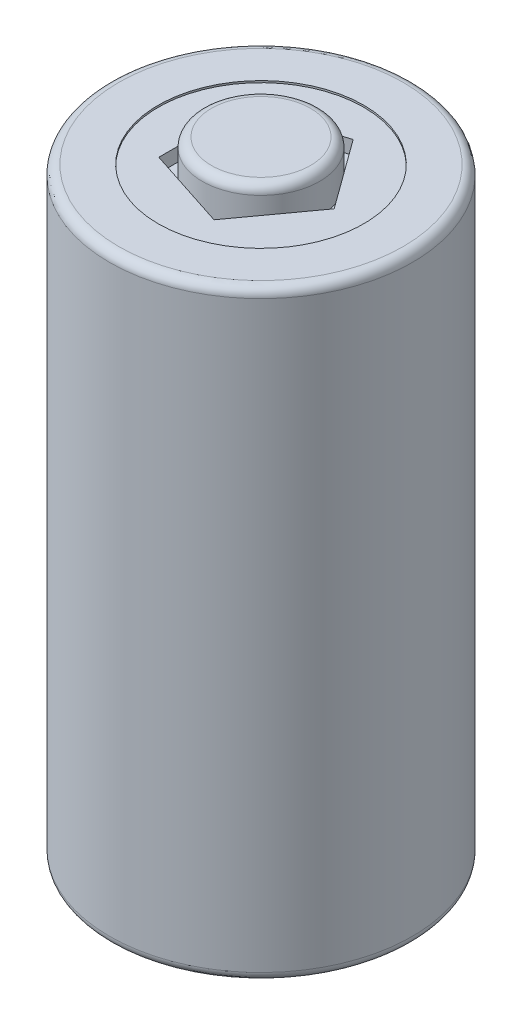
ISO-10303-21;
HEADER;
FILE_DESCRIPTION(('STEP AP214'),'2;1');
FILE_NAME('part.step','',(''),(''),'','','');
FILE_SCHEMA(('AUTOMOTIVE_DESIGN { 1 0 10303 214 1 1 1 1 }'));
ENDSEC;
DATA;
#1=APPLICATION_CONTEXT('core data for automotive mechanical design processes');
#2=APPLICATION_PROTOCOL_DEFINITION('international standard','automotive_design',2000,#1);
#3=PRODUCT_CONTEXT('',#1,'mechanical');
#4=PRODUCT('Part','Part','',(#3));
#5=PRODUCT_RELATED_PRODUCT_CATEGORY('part','',(#4));
#6=PRODUCT_DEFINITION_FORMATION('','',#4);
#7=PRODUCT_DEFINITION_CONTEXT('part definition',#1,'design');
#8=PRODUCT_DEFINITION('design','',#6,#7);
#9=PRODUCT_DEFINITION_SHAPE('','',#8);
#10=(LENGTH_UNIT() NAMED_UNIT(*) SI_UNIT(.MILLI.,.METRE.));
#11=(NAMED_UNIT(*) PLANE_ANGLE_UNIT() SI_UNIT($,.RADIAN.));
#12=(NAMED_UNIT(*) SI_UNIT($,.STERADIAN.) SOLID_ANGLE_UNIT());
#13=UNCERTAINTY_MEASURE_WITH_UNIT(LENGTH_MEASURE(1.E-05),#10,'distance_accuracy_value','');
#14=(GEOMETRIC_REPRESENTATION_CONTEXT(3) GLOBAL_UNCERTAINTY_ASSIGNED_CONTEXT((#13)) GLOBAL_UNIT_ASSIGNED_CONTEXT((#10,
#11,#12)) REPRESENTATION_CONTEXT('',''));
#15=CARTESIAN_POINT('',(0.,0.,0.));
#16=DIRECTION('',(0.,0.,1.));
#17=DIRECTION('',(1.,0.,0.));
#18=AXIS2_PLACEMENT_3D('',#15,#16,#17);
#19=CARTESIAN_POINT('',(0.,-16.4,0.));
#20=DIRECTION('',(0.,-1.,0.));
#21=DIRECTION('',(0.,0.,-1.));
#22=AXIS2_PLACEMENT_3D('',#19,#20,#21);
#23=CYLINDRICAL_SURFACE('',#22,8.24999999999999);
#24=CARTESIAN_POINT('',(0.,-15.9,0.));
#25=DIRECTION('',(0.,-1.,0.));
#26=DIRECTION('',(0.,0.,-1.));
#27=AXIS2_PLACEMENT_3D('',#24,#25,#26);
#28=CIRCLE('',#27,8.24999999999999);
#29=CARTESIAN_POINT('',(0.,-15.9,-8.24999999999999));
#30=VERTEX_POINT('',#29);
#31=EDGE_CURVE('E44',#30,#30,#28,.F.);
#32=ORIENTED_EDGE('',*,*,#31,.T.);
#33=EDGE_LOOP('',(#32));
#34=FACE_BOUND('',#33,.T.);
#35=CARTESIAN_POINT('',(0.,15.9,0.));
#36=DIRECTION('',(0.,1.,0.));
#37=DIRECTION('',(0.,0.,1.));
#38=AXIS2_PLACEMENT_3D('',#35,#36,#37);
#39=CIRCLE('',#38,8.24999999999999);
#40=CARTESIAN_POINT('',(0.,15.9,8.24999999999999));
#41=VERTEX_POINT('',#40);
#42=EDGE_CURVE('E151',#41,#41,#39,.F.);
#43=ORIENTED_EDGE('',*,*,#42,.T.);
#44=EDGE_LOOP('',(#43));
#45=FACE_BOUND('',#44,.T.);
#46=ADVANCED_FACE('F36',(#34,#45),#23,.T.);
#47=CARTESIAN_POINT('',(0.,16.4,0.));
#48=DIRECTION('',(0.,1.,0.));
#49=DIRECTION('',(0.,0.,1.));
#50=AXIS2_PLACEMENT_3D('',#47,#48,#49);
#51=PLANE('',#50);
#52=CARTESIAN_POINT('',(0.,16.4,0.));
#53=DIRECTION('',(0.,1.,0.));
#54=DIRECTION('',(0.,0.,1.));
#55=AXIS2_PLACEMENT_3D('',#52,#53,#54);
#56=CIRCLE('',#55,7.74999999999999);
#57=CARTESIAN_POINT('',(0.,16.4,7.74999999999999));
#58=VERTEX_POINT('',#57);
#59=EDGE_CURVE('E12',#58,#58,#56,.T.);
#60=ORIENTED_EDGE('',*,*,#59,.T.);
#61=EDGE_LOOP('',(#60));
#62=FACE_BOUND('',#61,.T.);
#63=CARTESIAN_POINT('',(0.,16.4,0.));
#64=DIRECTION('',(0.,1.,0.));
#65=DIRECTION('',(0.,0.,1.));
#66=AXIS2_PLACEMENT_3D('',#63,#64,#65);
#67=CIRCLE('',#66,5.6);
#68=CARTESIAN_POINT('',(0.,16.4,5.6));
#69=VERTEX_POINT('',#68);
#70=EDGE_CURVE('E127',#69,#69,#67,.T.);
#71=ORIENTED_EDGE('',*,*,#70,.F.);
#72=EDGE_LOOP('',(#71));
#73=FACE_BOUND('',#72,.T.);
#74=ADVANCED_FACE('F168',(#62,#73),#51,.T.);
#75=CARTESIAN_POINT('',(0.,-16.4,0.));
#76=DIRECTION('',(0.,-1.,0.));
#77=DIRECTION('',(0.,0.,-1.));
#78=AXIS2_PLACEMENT_3D('',#75,#76,#77);
#79=PLANE('',#78);
#80=CARTESIAN_POINT('',(0.,-16.4,0.));
#81=DIRECTION('',(0.,-1.,0.));
#82=DIRECTION('',(0.,0.,-1.));
#83=AXIS2_PLACEMENT_3D('',#80,#81,#82);
#84=CIRCLE('',#83,7.74999999999999);
#85=CARTESIAN_POINT('',(0.,-16.4,-7.74999999999999));
#86=VERTEX_POINT('',#85);
#87=EDGE_CURVE('E148',#86,#86,#84,.T.);
#88=ORIENTED_EDGE('',*,*,#87,.T.);
#89=EDGE_LOOP('',(#88));
#90=FACE_BOUND('',#89,.T.);
#91=CARTESIAN_POINT('',(0.,-16.4,0.));
#92=DIRECTION('',(0.,-1.,0.));
#93=DIRECTION('',(0.,0.,-1.));
#94=AXIS2_PLACEMENT_3D('',#91,#92,#93);
#95=CIRCLE('',#94,5.6);
#96=CARTESIAN_POINT('',(0.,-16.4,-5.6));
#97=VERTEX_POINT('',#96);
#98=EDGE_CURVE('E134',#97,#97,#95,.T.);
#99=ORIENTED_EDGE('',*,*,#98,.F.);
#100=EDGE_LOOP('',(#99));
#101=FACE_BOUND('',#100,.T.);
#102=ADVANCED_FACE('F164',(#90,#101),#79,.T.);
#103=CARTESIAN_POINT('',(0.,-15.65,0.));
#104=DIRECTION('',(0.,-1.,0.));
#105=DIRECTION('',(0.,0.,-1.));
#106=AXIS2_PLACEMENT_3D('',#103,#104,#105);
#107=CYLINDRICAL_SURFACE('',#106,5.6);
#108=CARTESIAN_POINT('',(0.,-16.3,0.));
#109=DIRECTION('',(0.,-1.,0.));
#110=DIRECTION('',(0.,0.,-1.));
#111=AXIS2_PLACEMENT_3D('',#108,#109,#110);
#112=CIRCLE('',#111,5.6);
#113=CARTESIAN_POINT('',(0.,-16.3,-5.6));
#114=VERTEX_POINT('',#113);
#115=EDGE_CURVE('E249',#114,#114,#112,.T.);
#116=ORIENTED_EDGE('',*,*,#115,.F.);
#117=EDGE_LOOP('',(#116));
#118=FACE_BOUND('',#117,.T.);
#119=ORIENTED_EDGE('',*,*,#98,.T.);
#120=EDGE_LOOP('',(#119));
#121=FACE_BOUND('',#120,.T.);
#122=ADVANCED_FACE('F167',(#118,#121),#107,.F.);
#123=CARTESIAN_POINT('',(0.,16.3,0.));
#124=DIRECTION('',(0.,1.,0.));
#125=DIRECTION('',(0.,0.,1.));
#126=AXIS2_PLACEMENT_3D('',#123,#124,#125);
#127=CYLINDRICAL_SURFACE('',#126,5.6);
#128=CARTESIAN_POINT('',(0.,16.3,0.));
#129=DIRECTION('',(0.,1.,0.));
#130=DIRECTION('',(0.,0.,1.));
#131=AXIS2_PLACEMENT_3D('',#128,#129,#130);
#132=CIRCLE('',#131,5.6);
#133=CARTESIAN_POINT('',(0.,16.3,5.6));
#134=VERTEX_POINT('',#133);
#135=EDGE_CURVE('E131',#134,#134,#132,.T.);
#136=ORIENTED_EDGE('',*,*,#135,.F.);
#137=EDGE_LOOP('',(#136));
#138=FACE_BOUND('',#137,.T.);
#139=ORIENTED_EDGE('',*,*,#70,.T.);
#140=EDGE_LOOP('',(#139));
#141=FACE_BOUND('',#140,.T.);
#142=ADVANCED_FACE('F173',(#138,#141),#127,.F.);
#143=CARTESIAN_POINT('',(0.,16.3,0.));
#144=DIRECTION('',(0.,1.,0.));
#145=DIRECTION('',(0.,0.,1.));
#146=AXIS2_PLACEMENT_3D('',#143,#144,#145);
#147=PLANE('',#146);
#148=DIRECTION('',(-0.951056516295154,0.,0.309016994374947));
#149=VECTOR('',#148,1.);
#150=CARTESIAN_POINT('',(1.23184038628159,16.3,-3.79121487728645));
#151=LINE('',#150,#149);
#152=CARTESIAN_POINT('',(1.23184038628159,16.3,-3.79121487728645));
#153=VERTEX_POINT('',#152);
#154=CARTESIAN_POINT('',(-3.225,16.3,-2.34309965281729));
#155=VERTEX_POINT('',#154);
#156=EDGE_CURVE('E51',#153,#155,#151,.T.);
#157=ORIENTED_EDGE('',*,*,#156,.F.);
#158=DIRECTION('',(-0.587785252292474,0.,-0.809016994374947));
#159=VECTOR('',#158,1.);
#160=CARTESIAN_POINT('',(3.98631922743683,16.3,0.));
#161=LINE('',#160,#159);
#162=CARTESIAN_POINT('',(3.98631922743683,16.3,0.));
#163=VERTEX_POINT('',#162);
#164=EDGE_CURVE('E124',#163,#153,#161,.T.);
#165=ORIENTED_EDGE('',*,*,#164,.F.);
#166=DIRECTION('',(0.587785252292478,0.,-0.809016994374944));
#167=VECTOR('',#166,1.);
#168=CARTESIAN_POINT('',(1.23184038628157,16.3,3.79121487728643));
#169=LINE('',#168,#167);
#170=CARTESIAN_POINT('',(1.23184038628157,16.3,3.79121487728643));
#171=VERTEX_POINT('',#170);
#172=EDGE_CURVE('E122',#171,#163,#169,.T.);
#173=ORIENTED_EDGE('',*,*,#172,.F.);
#174=DIRECTION('',(0.951056516295155,0.,0.309016994374943));
#175=VECTOR('',#174,1.);
#176=CARTESIAN_POINT('',(-3.22500000000002,16.3,2.34309965281729));
#177=LINE('',#176,#175);
#178=CARTESIAN_POINT('',(-3.22500000000002,16.3,2.34309965281729));
#179=VERTEX_POINT('',#178);
#180=EDGE_CURVE('E93',#179,#171,#177,.T.);
#181=ORIENTED_EDGE('',*,*,#180,.F.);
#182=DIRECTION('',(0.,0.,1.));
#183=VECTOR('',#182,1.);
#184=CARTESIAN_POINT('',(-3.225,16.3,-2.34309965281729));
#185=LINE('',#184,#183);
#186=EDGE_CURVE('E117',#155,#179,#185,.T.);
#187=ORIENTED_EDGE('',*,*,#186,.F.);
#188=EDGE_LOOP('',(#157,#165,#173,#181,#187));
#189=FACE_BOUND('',#188,.T.);
#190=ORIENTED_EDGE('',*,*,#135,.T.);
#191=EDGE_LOOP('',(#190));
#192=FACE_BOUND('',#191,.T.);
#193=ADVANCED_FACE('F179',(#189,#192),#147,.T.);
#194=CARTESIAN_POINT('',(1.23184038628159,15.55,-3.79121487728645));
#195=DIRECTION('',(-0.309016994374947,0.,-0.951056516295154));
#196=DIRECTION('',(-0.951056516295154,0.,0.309016994374947));
#197=AXIS2_PLACEMENT_3D('',#194,#195,#196);
#198=PLANE('',#197);
#199=ORIENTED_EDGE('',*,*,#156,.T.);
#200=DIRECTION('',(0.,1.,0.));
#201=VECTOR('',#200,1.);
#202=CARTESIAN_POINT('',(-3.225,15.55,-2.34309965281729));
#203=LINE('',#202,#201);
#204=CARTESIAN_POINT('',(-3.225,15.55,-2.34309965281729));
#205=VERTEX_POINT('',#204);
#206=EDGE_CURVE('E78',#205,#155,#203,.T.);
#207=ORIENTED_EDGE('',*,*,#206,.F.);
#208=DIRECTION('',(-0.951056516295154,0.,0.309016994374947));
#209=VECTOR('',#208,1.);
#210=CARTESIAN_POINT('',(1.23184038628159,15.55,-3.79121487728645));
#211=LINE('',#210,#209);
#212=CARTESIAN_POINT('',(1.23184038628159,15.55,-3.79121487728645));
#213=VERTEX_POINT('',#212);
#214=EDGE_CURVE('E111',#213,#205,#211,.T.);
#215=ORIENTED_EDGE('',*,*,#214,.F.);
#216=DIRECTION('',(0.,1.,0.));
#217=VECTOR('',#216,1.);
#218=CARTESIAN_POINT('',(1.23184038628159,15.55,-3.79121487728645));
#219=LINE('',#218,#217);
#220=EDGE_CURVE('E59',#213,#153,#219,.T.);
#221=ORIENTED_EDGE('',*,*,#220,.T.);
#222=EDGE_LOOP('',(#199,#207,#215,#221));
#223=FACE_BOUND('',#222,.T.);
#224=ADVANCED_FACE('F228',(#223),#198,.F.);
#225=CARTESIAN_POINT('',(3.98631922743683,15.55,0.));
#226=DIRECTION('',(0.809016994374947,0.,-0.587785252292474));
#227=DIRECTION('',(-0.587785252292474,0.,-0.809016994374947));
#228=AXIS2_PLACEMENT_3D('',#225,#226,#227);
#229=PLANE('',#228);
#230=ORIENTED_EDGE('',*,*,#164,.T.);
#231=ORIENTED_EDGE('',*,*,#220,.F.);
#232=DIRECTION('',(-0.587785252292474,0.,-0.809016994374947));
#233=VECTOR('',#232,1.);
#234=CARTESIAN_POINT('',(3.98631922743683,15.55,0.));
#235=LINE('',#234,#233);
#236=CARTESIAN_POINT('',(3.98631922743683,15.55,0.));
#237=VERTEX_POINT('',#236);
#238=EDGE_CURVE('E105',#237,#213,#235,.T.);
#239=ORIENTED_EDGE('',*,*,#238,.F.);
#240=DIRECTION('',(0.,1.,0.));
#241=VECTOR('',#240,1.);
#242=CARTESIAN_POINT('',(3.98631922743683,15.55,0.));
#243=LINE('',#242,#241);
#244=EDGE_CURVE('E97',#237,#163,#243,.T.);
#245=ORIENTED_EDGE('',*,*,#244,.T.);
#246=EDGE_LOOP('',(#230,#231,#239,#245));
#247=FACE_BOUND('',#246,.T.);
#248=ADVANCED_FACE('F225',(#247),#229,.F.);
#249=CARTESIAN_POINT('',(1.23184038628157,15.55,3.79121487728643));
#250=DIRECTION('',(0.809016994374944,0.,0.587785252292478));
#251=DIRECTION('',(0.587785252292478,0.,-0.809016994374944));
#252=AXIS2_PLACEMENT_3D('',#249,#250,#251);
#253=PLANE('',#252);
#254=ORIENTED_EDGE('',*,*,#172,.T.);
#255=ORIENTED_EDGE('',*,*,#244,.F.);
#256=DIRECTION('',(0.587785252292478,0.,-0.809016994374944));
#257=VECTOR('',#256,1.);
#258=CARTESIAN_POINT('',(1.23184038628157,15.55,3.79121487728643));
#259=LINE('',#258,#257);
#260=CARTESIAN_POINT('',(1.23184038628157,15.55,3.79121487728643));
#261=VERTEX_POINT('',#260);
#262=EDGE_CURVE('E101',#261,#237,#259,.T.);
#263=ORIENTED_EDGE('',*,*,#262,.F.);
#264=DIRECTION('',(0.,1.,0.));
#265=VECTOR('',#264,1.);
#266=CARTESIAN_POINT('',(1.23184038628157,15.55,3.79121487728643));
#267=LINE('',#266,#265);
#268=EDGE_CURVE('E86',#261,#171,#267,.T.);
#269=ORIENTED_EDGE('',*,*,#268,.T.);
#270=EDGE_LOOP('',(#254,#255,#263,#269));
#271=FACE_BOUND('',#270,.T.);
#272=ADVANCED_FACE('F102',(#271),#253,.F.);
#273=CARTESIAN_POINT('',(-3.22500000000002,15.55,2.34309965281729));
#274=DIRECTION('',(-0.309016994374943,0.,0.951056516295155));
#275=DIRECTION('',(0.951056516295155,0.,0.309016994374943));
#276=AXIS2_PLACEMENT_3D('',#273,#274,#275);
#277=PLANE('',#276);
#278=ORIENTED_EDGE('',*,*,#180,.T.);
#279=ORIENTED_EDGE('',*,*,#268,.F.);
#280=DIRECTION('',(0.951056516295155,0.,0.309016994374943));
#281=VECTOR('',#280,1.);
#282=CARTESIAN_POINT('',(-3.22500000000002,15.55,2.34309965281729));
#283=LINE('',#282,#281);
#284=CARTESIAN_POINT('',(-3.22500000000002,15.55,2.34309965281729));
#285=VERTEX_POINT('',#284);
#286=EDGE_CURVE('E90',#285,#261,#283,.T.);
#287=ORIENTED_EDGE('',*,*,#286,.F.);
#288=DIRECTION('',(0.,1.,0.));
#289=VECTOR('',#288,1.);
#290=CARTESIAN_POINT('',(-3.22500000000002,15.55,2.34309965281729));
#291=LINE('',#290,#289);
#292=EDGE_CURVE('E98',#285,#179,#291,.T.);
#293=ORIENTED_EDGE('',*,*,#292,.T.);
#294=EDGE_LOOP('',(#278,#279,#287,#293));
#295=FACE_BOUND('',#294,.T.);
#296=ADVANCED_FACE('F88',(#295),#277,.F.);
#297=CARTESIAN_POINT('',(-3.225,15.55,-2.34309965281729));
#298=DIRECTION('',(-1.,0.,0.));
#299=DIRECTION('',(0.,0.,1.));
#300=AXIS2_PLACEMENT_3D('',#297,#298,#299);
#301=PLANE('',#300);
#302=ORIENTED_EDGE('',*,*,#186,.T.);
#303=ORIENTED_EDGE('',*,*,#292,.F.);
#304=DIRECTION('',(0.,0.,1.));
#305=VECTOR('',#304,1.);
#306=CARTESIAN_POINT('',(-3.225,15.55,-2.34309965281729));
#307=LINE('',#306,#305);
#308=EDGE_CURVE('E109',#205,#285,#307,.T.);
#309=ORIENTED_EDGE('',*,*,#308,.F.);
#310=ORIENTED_EDGE('',*,*,#206,.T.);
#311=EDGE_LOOP('',(#302,#303,#309,#310));
#312=FACE_BOUND('',#311,.T.);
#313=ADVANCED_FACE('F217',(#312),#301,.F.);
#314=CARTESIAN_POINT('',(1.23184038628159,15.55,-3.79121487728645));
#315=DIRECTION('',(0.,-1.,0.));
#316=DIRECTION('',(0.,0.,-1.));
#317=AXIS2_PLACEMENT_3D('',#314,#315,#316);
#318=PLANE('',#317);
#319=CARTESIAN_POINT('',(0.,15.55,0.));
#320=DIRECTION('',(0.,-1.,0.));
#321=DIRECTION('',(0.,0.,-1.));
#322=AXIS2_PLACEMENT_3D('',#319,#320,#321);
#323=CIRCLE('',#322,3.2);
#324=CARTESIAN_POINT('',(0.,15.55,-3.2));
#325=VERTEX_POINT('',#324);
#326=EDGE_CURVE('E139',#325,#325,#323,.F.);
#327=ORIENTED_EDGE('',*,*,#326,.F.);
#328=EDGE_LOOP('',(#327));
#329=FACE_BOUND('',#328,.T.);
#330=ORIENTED_EDGE('',*,*,#214,.T.);
#331=ORIENTED_EDGE('',*,*,#308,.T.);
#332=ORIENTED_EDGE('',*,*,#286,.T.);
#333=ORIENTED_EDGE('',*,*,#262,.T.);
#334=ORIENTED_EDGE('',*,*,#238,.T.);
#335=EDGE_LOOP('',(#330,#331,#332,#333,#334));
#336=FACE_BOUND('',#335,.T.);
#337=ADVANCED_FACE('F108',(#329,#336),#318,.F.);
#338=CARTESIAN_POINT('',(0.,90.6509667991878,0.));
#339=DIRECTION('',(0.,-1.,0.));
#340=DIRECTION('',(0.,0.,-1.));
#341=AXIS2_PLACEMENT_3D('',#338,#339,#340);
#342=CYLINDRICAL_SURFACE('',#341,3.2);
#343=CARTESIAN_POINT('',(0.,17.2,0.));
#344=DIRECTION('',(0.,-1.,0.));
#345=DIRECTION('',(0.,0.,-1.));
#346=AXIS2_PLACEMENT_3D('',#343,#344,#345);
#347=CIRCLE('',#346,3.2);
#348=CARTESIAN_POINT('',(0.,17.2,-3.2));
#349=VERTEX_POINT('',#348);
#350=EDGE_CURVE('E142',#349,#349,#347,.T.);
#351=ORIENTED_EDGE('',*,*,#350,.T.);
#352=EDGE_LOOP('',(#351));
#353=FACE_BOUND('',#352,.T.);
#354=ORIENTED_EDGE('',*,*,#326,.T.);
#355=EDGE_LOOP('',(#354));
#356=FACE_BOUND('',#355,.T.);
#357=ADVANCED_FACE('F204',(#353,#356),#342,.T.);
#358=CARTESIAN_POINT('',(0.,17.7,0.));
#359=DIRECTION('',(0.,-1.,0.));
#360=DIRECTION('',(0.,0.,-1.));
#361=AXIS2_PLACEMENT_3D('',#358,#359,#360);
#362=PLANE('',#361);
#363=CARTESIAN_POINT('',(0.,17.7,0.));
#364=DIRECTION('',(0.,-1.,0.));
#365=DIRECTION('',(0.,0.,-1.));
#366=AXIS2_PLACEMENT_3D('',#363,#364,#365);
#367=CIRCLE('',#366,2.7);
#368=CARTESIAN_POINT('',(0.,17.7,-2.7));
#369=VERTEX_POINT('',#368);
#370=EDGE_CURVE('E145',#369,#369,#367,.F.);
#371=ORIENTED_EDGE('',*,*,#370,.T.);
#372=EDGE_LOOP('',(#371));
#373=FACE_BOUND('',#372,.T.);
#374=ADVANCED_FACE('F195',(#373),#362,.F.);
#375=CARTESIAN_POINT('',(0.,17.2,0.));
#376=DIRECTION('',(0.,-1.,0.));
#377=DIRECTION('',(0.,0.,-1.));
#378=AXIS2_PLACEMENT_3D('',#375,#376,#377);
#379=TOROIDAL_SURFACE('',#378,2.7,0.5);
#380=ORIENTED_EDGE('',*,*,#370,.F.);
#381=EDGE_LOOP('',(#380));
#382=FACE_BOUND('',#381,.T.);
#383=ORIENTED_EDGE('',*,*,#350,.F.);
#384=EDGE_LOOP('',(#383));
#385=FACE_BOUND('',#384,.T.);
#386=ADVANCED_FACE('F192',(#382,#385),#379,.T.);
#387=CARTESIAN_POINT('',(0.,1.60340546095177,0.));
#388=DIRECTION('',(0.,-1.,0.));
#389=DIRECTION('',(0.,0.,-1.));
#390=AXIS2_PLACEMENT_3D('',#387,#388,#389);
#391=CYLINDRICAL_SURFACE('',#390,6.1);
#392=CARTESIAN_POINT('',(0.,-15.65,0.));
#393=DIRECTION('',(0.,-1.,0.));
#394=DIRECTION('',(0.,0.,-1.));
#395=AXIS2_PLACEMENT_3D('',#392,#393,#394);
#396=CIRCLE('',#395,6.1);
#397=CARTESIAN_POINT('',(0.,-15.65,-6.1));
#398=VERTEX_POINT('',#397);
#399=EDGE_CURVE('E118',#398,#398,#396,.F.);
#400=ORIENTED_EDGE('',*,*,#399,.T.);
#401=EDGE_LOOP('',(#400));
#402=FACE_BOUND('',#401,.T.);
#403=CARTESIAN_POINT('',(0.,-16.3,0.));
#404=DIRECTION('',(0.,-1.,0.));
#405=DIRECTION('',(0.,0.,-1.));
#406=AXIS2_PLACEMENT_3D('',#403,#404,#405);
#407=CIRCLE('',#406,6.1);
#408=CARTESIAN_POINT('',(0.,-16.3,-6.1));
#409=VERTEX_POINT('',#408);
#410=EDGE_CURVE('E246',#409,#409,#407,.T.);
#411=ORIENTED_EDGE('',*,*,#410,.T.);
#412=EDGE_LOOP('',(#411));
#413=FACE_BOUND('',#412,.T.);
#414=ADVANCED_FACE('F194',(#402,#413),#391,.F.);
#415=CARTESIAN_POINT('',(0.,-16.3,0.));
#416=DIRECTION('',(0.,-1.,0.));
#417=DIRECTION('',(0.,0.,-1.));
#418=AXIS2_PLACEMENT_3D('',#415,#416,#417);
#419=PLANE('',#418);
#420=ORIENTED_EDGE('',*,*,#115,.T.);
#421=EDGE_LOOP('',(#420));
#422=FACE_BOUND('',#421,.T.);
#423=ORIENTED_EDGE('',*,*,#410,.F.);
#424=EDGE_LOOP('',(#423));
#425=FACE_BOUND('',#424,.T.);
#426=ADVANCED_FACE('F201',(#422,#425),#419,.F.);
#427=CARTESIAN_POINT('',(0.,-15.65,0.));
#428=DIRECTION('',(0.,-1.,0.));
#429=DIRECTION('',(0.,0.,-1.));
#430=AXIS2_PLACEMENT_3D('',#427,#428,#429);
#431=PLANE('',#430);
#432=ORIENTED_EDGE('',*,*,#399,.F.);
#433=EDGE_LOOP('',(#432));
#434=FACE_BOUND('',#433,.T.);
#435=ADVANCED_FACE('F161',(#434),#431,.T.);
#436=CARTESIAN_POINT('',(0.,-15.9,0.));
#437=DIRECTION('',(0.,-1.,0.));
#438=DIRECTION('',(0.,0.,-1.));
#439=AXIS2_PLACEMENT_3D('',#436,#437,#438);
#440=TOROIDAL_SURFACE('',#439,7.74999999999999,0.5);
#441=ORIENTED_EDGE('',*,*,#31,.F.);
#442=EDGE_LOOP('',(#441));
#443=FACE_BOUND('',#442,.T.);
#444=ORIENTED_EDGE('',*,*,#87,.F.);
#445=EDGE_LOOP('',(#444));
#446=FACE_BOUND('',#445,.T.);
#447=ADVANCED_FACE('F158',(#443,#446),#440,.T.);
#448=CARTESIAN_POINT('',(0.,15.9,0.));
#449=DIRECTION('',(0.,1.,0.));
#450=DIRECTION('',(0.,0.,1.));
#451=AXIS2_PLACEMENT_3D('',#448,#449,#450);
#452=TOROIDAL_SURFACE('',#451,7.74999999999999,0.5);
#453=ORIENTED_EDGE('',*,*,#59,.F.);
#454=EDGE_LOOP('',(#453));
#455=FACE_BOUND('',#454,.T.);
#456=ORIENTED_EDGE('',*,*,#42,.F.);
#457=EDGE_LOOP('',(#456));
#458=FACE_BOUND('',#457,.T.);
#459=ADVANCED_FACE('F38',(#455,#458),#452,.T.);
#460=CLOSED_SHELL('',(#46,#74,#102,#122,#142,#193,#224,#248,#272,#296,#313,#337,#357,#374,#386,
#414,#426,#435,#447,#459));
#461=MANIFOLD_SOLID_BREP('B2',#460);
#462=ADVANCED_BREP_SHAPE_REPRESENTATION('',(#18,#461),#14);
#463=SHAPE_DEFINITION_REPRESENTATION(#9,#462);
ENDSEC;
END-ISO-10303-21;
